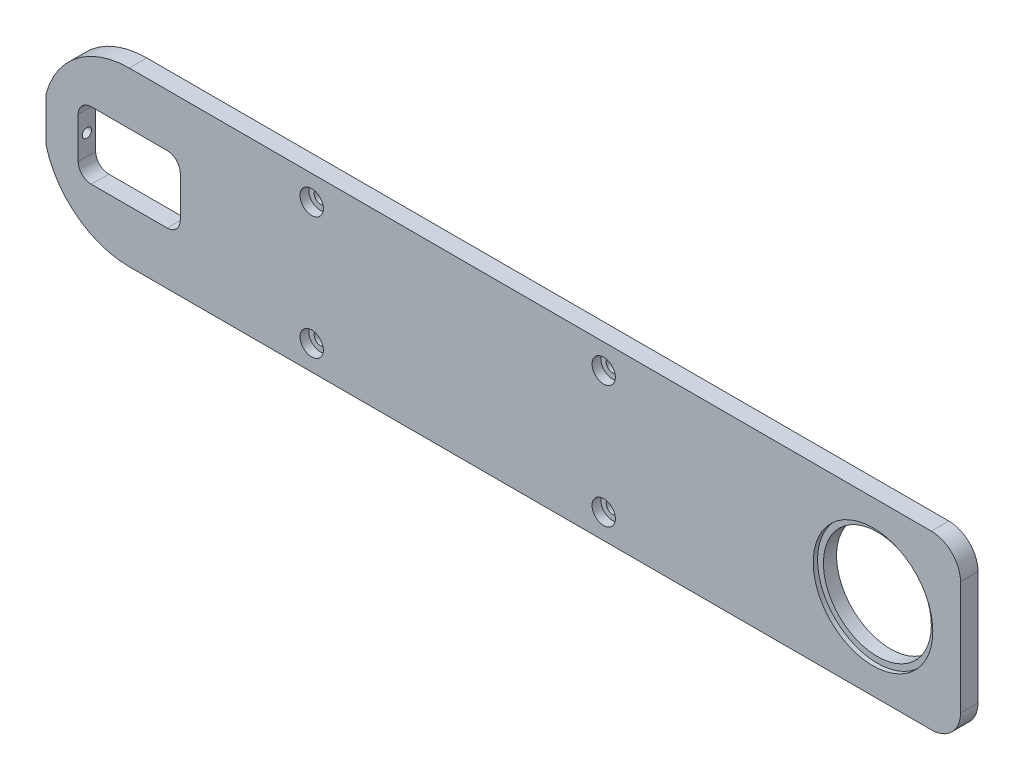
ISO-10303-21;
HEADER;
FILE_DESCRIPTION(('STEP AP214'),'2;1');
FILE_NAME('part.step','',(''),(''),'','','');
FILE_SCHEMA(('AUTOMOTIVE_DESIGN { 1 0 10303 214 1 1 1 1 }'));
ENDSEC;
DATA;
#1=APPLICATION_CONTEXT('core data for automotive mechanical design processes');
#2=APPLICATION_PROTOCOL_DEFINITION('international standard','automotive_design',2000,#1);
#3=PRODUCT_CONTEXT('',#1,'mechanical');
#4=PRODUCT('Part','Part','',(#3));
#5=PRODUCT_RELATED_PRODUCT_CATEGORY('part','',(#4));
#6=PRODUCT_DEFINITION_FORMATION('','',#4);
#7=PRODUCT_DEFINITION_CONTEXT('part definition',#1,'design');
#8=PRODUCT_DEFINITION('design','',#6,#7);
#9=PRODUCT_DEFINITION_SHAPE('','',#8);
#10=(LENGTH_UNIT() NAMED_UNIT(*) SI_UNIT(.MILLI.,.METRE.));
#11=(NAMED_UNIT(*) PLANE_ANGLE_UNIT() SI_UNIT($,.RADIAN.));
#12=(NAMED_UNIT(*) SI_UNIT($,.STERADIAN.) SOLID_ANGLE_UNIT());
#13=UNCERTAINTY_MEASURE_WITH_UNIT(LENGTH_MEASURE(1.E-05),#10,'distance_accuracy_value','');
#14=(GEOMETRIC_REPRESENTATION_CONTEXT(3) GLOBAL_UNCERTAINTY_ASSIGNED_CONTEXT((#13)) GLOBAL_UNIT_ASSIGNED_CONTEXT((#10,
#11,#12)) REPRESENTATION_CONTEXT('',''));
#15=CARTESIAN_POINT('',(0.,0.,0.));
#16=DIRECTION('',(0.,0.,1.));
#17=DIRECTION('',(1.,0.,0.));
#18=AXIS2_PLACEMENT_3D('',#15,#16,#17);
#19=CARTESIAN_POINT('',(-255.,0.,3.));
#20=DIRECTION('',(0.,0.,-1.));
#21=DIRECTION('',(-1.,0.,0.));
#22=AXIS2_PLACEMENT_3D('',#19,#20,#21);
#23=CYLINDRICAL_SURFACE('',#22,29.5);
#24=CARTESIAN_POINT('',(-255.,0.,-3.));
#25=DIRECTION('',(0.,0.,1.));
#26=DIRECTION('',(1.,0.,0.));
#27=AXIS2_PLACEMENT_3D('',#24,#25,#26);
#28=CIRCLE('',#27,29.5);
#29=CARTESIAN_POINT('',(-255.,29.5,-3.));
#30=VERTEX_POINT('',#29);
#31=CARTESIAN_POINT('',(-283.530685235374,7.5,-3.));
#32=VERTEX_POINT('',#31);
#33=EDGE_CURVE('E207',#30,#32,#28,.T.);
#34=ORIENTED_EDGE('',*,*,#33,.T.);
#35=DIRECTION('',(0.,0.,1.));
#36=VECTOR('',#35,1.);
#37=CARTESIAN_POINT('',(-283.530685235374,7.5,-3.));
#38=LINE('',#37,#36);
#39=CARTESIAN_POINT('',(-283.530685235374,7.5,3.));
#40=VERTEX_POINT('',#39);
#41=EDGE_CURVE('E191',#32,#40,#38,.T.);
#42=ORIENTED_EDGE('',*,*,#41,.T.);
#43=CARTESIAN_POINT('',(-255.,0.,3.));
#44=DIRECTION('',(0.,0.,1.));
#45=DIRECTION('',(1.,0.,0.));
#46=AXIS2_PLACEMENT_3D('',#43,#44,#45);
#47=CIRCLE('',#46,29.5);
#48=CARTESIAN_POINT('',(-255.,29.5,3.));
#49=VERTEX_POINT('',#48);
#50=EDGE_CURVE('E394',#49,#40,#47,.T.);
#51=ORIENTED_EDGE('',*,*,#50,.F.);
#52=DIRECTION('',(0.,0.,-1.));
#53=VECTOR('',#52,1.);
#54=CARTESIAN_POINT('',(-255.,29.5,3.));
#55=LINE('',#54,#53);
#56=EDGE_CURVE('E213',#49,#30,#55,.T.);
#57=ORIENTED_EDGE('',*,*,#56,.T.);
#58=EDGE_LOOP('',(#34,#42,#51,#57));
#59=FACE_BOUND('',#58,.T.);
#60=ADVANCED_FACE('F80',(#59),#23,.T.);
#61=CARTESIAN_POINT('',(-92.3223164897252,21.,3.));
#62=DIRECTION('',(0.,0.,1.));
#63=DIRECTION('',(1.,0.,0.));
#64=AXIS2_PLACEMENT_3D('',#61,#62,#63);
#65=CYLINDRICAL_SURFACE('',#64,2.15);
#66=CARTESIAN_POINT('',(-92.3223164897252,21.,-3.));
#67=DIRECTION('',(0.,0.,1.));
#68=DIRECTION('',(1.,0.,0.));
#69=AXIS2_PLACEMENT_3D('',#66,#67,#68);
#70=CIRCLE('',#69,2.15);
#71=CARTESIAN_POINT('',(-90.1723164897251,21.,-3.));
#72=VERTEX_POINT('',#71);
#73=EDGE_CURVE('E344',#72,#72,#70,.T.);
#74=ORIENTED_EDGE('',*,*,#73,.F.);
#75=EDGE_LOOP('',(#74));
#76=FACE_BOUND('',#75,.T.);
#77=CARTESIAN_POINT('',(-92.3223164897252,21.,0.));
#78=DIRECTION('',(0.,0.,1.));
#79=DIRECTION('',(1.,0.,0.));
#80=AXIS2_PLACEMENT_3D('',#77,#78,#79);
#81=CIRCLE('',#80,2.15);
#82=CARTESIAN_POINT('',(-90.1723164897251,21.,0.));
#83=VERTEX_POINT('',#82);
#84=EDGE_CURVE('E279',#83,#83,#81,.F.);
#85=ORIENTED_EDGE('',*,*,#84,.F.);
#86=EDGE_LOOP('',(#85));
#87=FACE_BOUND('',#86,.T.);
#88=ADVANCED_FACE('F409',(#76,#87),#65,.F.);
#89=CARTESIAN_POINT('',(-92.3223164897252,-21.,3.));
#90=DIRECTION('',(0.,0.,1.));
#91=DIRECTION('',(1.,0.,0.));
#92=AXIS2_PLACEMENT_3D('',#89,#90,#91);
#93=CYLINDRICAL_SURFACE('',#92,2.15);
#94=CARTESIAN_POINT('',(-92.3223164897252,-21.,-3.));
#95=DIRECTION('',(0.,0.,1.));
#96=DIRECTION('',(1.,0.,0.));
#97=AXIS2_PLACEMENT_3D('',#94,#95,#96);
#98=CIRCLE('',#97,2.15);
#99=CARTESIAN_POINT('',(-90.1723164897251,-21.,-3.));
#100=VERTEX_POINT('',#99);
#101=EDGE_CURVE('E347',#100,#100,#98,.T.);
#102=ORIENTED_EDGE('',*,*,#101,.F.);
#103=EDGE_LOOP('',(#102));
#104=FACE_BOUND('',#103,.T.);
#105=CARTESIAN_POINT('',(-92.3223164897252,-21.,0.));
#106=DIRECTION('',(0.,0.,1.));
#107=DIRECTION('',(1.,0.,0.));
#108=AXIS2_PLACEMENT_3D('',#105,#106,#107);
#109=CIRCLE('',#108,2.15);
#110=CARTESIAN_POINT('',(-90.1723164897251,-21.,0.));
#111=VERTEX_POINT('',#110);
#112=EDGE_CURVE('E274',#111,#111,#109,.F.);
#113=ORIENTED_EDGE('',*,*,#112,.F.);
#114=EDGE_LOOP('',(#113));
#115=FACE_BOUND('',#114,.T.);
#116=ADVANCED_FACE('F415',(#104,#115),#93,.F.);
#117=CARTESIAN_POINT('',(-192.444390405176,-21.,3.));
#118=DIRECTION('',(0.,0.,1.));
#119=DIRECTION('',(1.,0.,0.));
#120=AXIS2_PLACEMENT_3D('',#117,#118,#119);
#121=CYLINDRICAL_SURFACE('',#120,2.15);
#122=CARTESIAN_POINT('',(-192.444390405176,-21.,-3.));
#123=DIRECTION('',(0.,0.,1.));
#124=DIRECTION('',(1.,0.,0.));
#125=AXIS2_PLACEMENT_3D('',#122,#123,#124);
#126=CIRCLE('',#125,2.14999999999999);
#127=CARTESIAN_POINT('',(-190.294390405176,-21.,-3.));
#128=VERTEX_POINT('',#127);
#129=EDGE_CURVE('E350',#128,#128,#126,.T.);
#130=ORIENTED_EDGE('',*,*,#129,.F.);
#131=EDGE_LOOP('',(#130));
#132=FACE_BOUND('',#131,.T.);
#133=CARTESIAN_POINT('',(-192.444390405176,-21.,0.));
#134=DIRECTION('',(0.,0.,1.));
#135=DIRECTION('',(1.,0.,0.));
#136=AXIS2_PLACEMENT_3D('',#133,#134,#135);
#137=CIRCLE('',#136,2.15);
#138=CARTESIAN_POINT('',(-190.294390405176,-21.,0.));
#139=VERTEX_POINT('',#138);
#140=EDGE_CURVE('E269',#139,#139,#137,.F.);
#141=ORIENTED_EDGE('',*,*,#140,.F.);
#142=EDGE_LOOP('',(#141));
#143=FACE_BOUND('',#142,.T.);
#144=ADVANCED_FACE('F665',(#132,#143),#121,.F.);
#145=CARTESIAN_POINT('',(-192.444390405176,21.,3.));
#146=DIRECTION('',(0.,0.,1.));
#147=DIRECTION('',(1.,0.,0.));
#148=AXIS2_PLACEMENT_3D('',#145,#146,#147);
#149=CYLINDRICAL_SURFACE('',#148,2.15);
#150=CARTESIAN_POINT('',(-192.444390405176,21.,-3.));
#151=DIRECTION('',(0.,0.,1.));
#152=DIRECTION('',(1.,0.,0.));
#153=AXIS2_PLACEMENT_3D('',#150,#151,#152);
#154=CIRCLE('',#153,2.14999999999999);
#155=CARTESIAN_POINT('',(-190.294390405176,21.,-3.));
#156=VERTEX_POINT('',#155);
#157=EDGE_CURVE('E267',#156,#156,#154,.T.);
#158=ORIENTED_EDGE('',*,*,#157,.F.);
#159=EDGE_LOOP('',(#158));
#160=FACE_BOUND('',#159,.T.);
#161=CARTESIAN_POINT('',(-192.444390405176,21.,0.));
#162=DIRECTION('',(0.,0.,1.));
#163=DIRECTION('',(1.,0.,0.));
#164=AXIS2_PLACEMENT_3D('',#161,#162,#163);
#165=CIRCLE('',#164,2.15);
#166=CARTESIAN_POINT('',(-190.294390405176,21.,0.));
#167=VERTEX_POINT('',#166);
#168=EDGE_CURVE('E264',#167,#167,#165,.F.);
#169=ORIENTED_EDGE('',*,*,#168,.F.);
#170=EDGE_LOOP('',(#169));
#171=FACE_BOUND('',#170,.T.);
#172=ADVANCED_FACE('F505',(#160,#171),#149,.F.);
#173=CARTESIAN_POINT('',(0.,0.,3.));
#174=DIRECTION('',(0.,0.,-1.));
#175=DIRECTION('',(-1.,0.,0.));
#176=AXIS2_PLACEMENT_3D('',#173,#174,#175);
#177=CYLINDRICAL_SURFACE('',#176,18.5);
#178=CARTESIAN_POINT('',(0.,0.,-3.));
#179=DIRECTION('',(0.,0.,1.));
#180=DIRECTION('',(1.,0.,0.));
#181=AXIS2_PLACEMENT_3D('',#178,#179,#180);
#182=CIRCLE('',#181,18.5);
#183=CARTESIAN_POINT('',(18.5,0.,-3.));
#184=VERTEX_POINT('',#183);
#185=EDGE_CURVE('E379',#184,#184,#182,.T.);
#186=ORIENTED_EDGE('',*,*,#185,.F.);
#187=EDGE_LOOP('',(#186));
#188=FACE_BOUND('',#187,.T.);
#189=CARTESIAN_POINT('',(0.,0.,1.5));
#190=DIRECTION('',(0.,0.,1.));
#191=DIRECTION('',(1.,0.,0.));
#192=AXIS2_PLACEMENT_3D('',#189,#190,#191);
#193=CIRCLE('',#192,18.5);
#194=CARTESIAN_POINT('',(18.5,0.,1.5));
#195=VERTEX_POINT('',#194);
#196=EDGE_CURVE('E356',#195,#195,#193,.T.);
#197=ORIENTED_EDGE('',*,*,#196,.T.);
#198=EDGE_LOOP('',(#197));
#199=FACE_BOUND('',#198,.T.);
#200=ADVANCED_FACE('F502',(#188,#199),#177,.F.);
#201=CARTESIAN_POINT('',(0.,0.,3.));
#202=DIRECTION('',(0.,0.,1.));
#203=DIRECTION('',(1.,0.,0.));
#204=AXIS2_PLACEMENT_3D('',#201,#202,#203);
#205=PLANE('',#204);
#206=DIRECTION('',(0.,1.,0.));
#207=VECTOR('',#206,1.);
#208=CARTESIAN_POINT('',(-283.530685235374,7.5,3.));
#209=LINE('',#208,#207);
#210=CARTESIAN_POINT('',(-283.530685235374,-7.5,3.));
#211=VERTEX_POINT('',#210);
#212=EDGE_CURVE('E195',#211,#40,#209,.T.);
#213=ORIENTED_EDGE('',*,*,#212,.F.);
#214=CARTESIAN_POINT('',(-255.,-29.5,3.));
#215=VERTEX_POINT('',#214);
#216=EDGE_CURVE('E393',#211,#215,#47,.T.);
#217=ORIENTED_EDGE('',*,*,#216,.T.);
#218=DIRECTION('',(-1.,0.,0.));
#219=VECTOR('',#218,1.);
#220=CARTESIAN_POINT('',(0.,-29.5,3.));
#221=LINE('',#220,#219);
#222=CARTESIAN_POINT('',(20.,-29.5,3.));
#223=VERTEX_POINT('',#222);
#224=EDGE_CURVE('E225',#223,#215,#221,.T.);
#225=ORIENTED_EDGE('',*,*,#224,.F.);
#226=CARTESIAN_POINT('',(20.,-19.5,3.));
#227=DIRECTION('',(0.,0.,1.));
#228=DIRECTION('',(1.,0.,0.));
#229=AXIS2_PLACEMENT_3D('',#226,#227,#228);
#230=CIRCLE('',#229,10.);
#231=CARTESIAN_POINT('',(30.,-19.5,3.));
#232=VERTEX_POINT('',#231);
#233=EDGE_CURVE('E288',#223,#232,#230,.T.);
#234=ORIENTED_EDGE('',*,*,#233,.T.);
#235=DIRECTION('',(0.,1.,0.));
#236=VECTOR('',#235,1.);
#237=CARTESIAN_POINT('',(30.,29.5,3.));
#238=LINE('',#237,#236);
#239=CARTESIAN_POINT('',(30.,19.5,3.));
#240=VERTEX_POINT('',#239);
#241=EDGE_CURVE('E316',#232,#240,#238,.T.);
#242=ORIENTED_EDGE('',*,*,#241,.T.);
#243=CARTESIAN_POINT('',(20.,19.5,3.));
#244=DIRECTION('',(0.,0.,1.));
#245=DIRECTION('',(1.,0.,0.));
#246=AXIS2_PLACEMENT_3D('',#243,#244,#245);
#247=CIRCLE('',#246,10.);
#248=CARTESIAN_POINT('',(20.,29.5,3.));
#249=VERTEX_POINT('',#248);
#250=EDGE_CURVE('E286',#240,#249,#247,.T.);
#251=ORIENTED_EDGE('',*,*,#250,.T.);
#252=DIRECTION('',(-1.,0.,0.));
#253=VECTOR('',#252,1.);
#254=CARTESIAN_POINT('',(0.,29.5,3.));
#255=LINE('',#254,#253);
#256=EDGE_CURVE('E216',#249,#49,#255,.T.);
#257=ORIENTED_EDGE('',*,*,#256,.T.);
#258=ORIENTED_EDGE('',*,*,#50,.T.);
#259=EDGE_LOOP('',(#213,#217,#225,#234,#242,#251,#257,#258));
#260=FACE_BOUND('',#259,.T.);
#261=CARTESIAN_POINT('',(-92.3223164897252,21.,3.));
#262=DIRECTION('',(0.,0.,1.));
#263=DIRECTION('',(1.,0.,0.));
#264=AXIS2_PLACEMENT_3D('',#261,#262,#263);
#265=CIRCLE('',#264,4.00000000000001);
#266=CARTESIAN_POINT('',(-88.3223164897252,21.,3.));
#267=VERTEX_POINT('',#266);
#268=EDGE_CURVE('E321',#267,#267,#265,.T.);
#269=ORIENTED_EDGE('',*,*,#268,.F.);
#270=EDGE_LOOP('',(#269));
#271=FACE_BOUND('',#270,.T.);
#272=CARTESIAN_POINT('',(-92.3223164897252,-21.,3.));
#273=DIRECTION('',(0.,0.,1.));
#274=DIRECTION('',(1.,0.,0.));
#275=AXIS2_PLACEMENT_3D('',#272,#273,#274);
#276=CIRCLE('',#275,4.00000000000001);
#277=CARTESIAN_POINT('',(-88.3223164897252,-21.,3.));
#278=VERTEX_POINT('',#277);
#279=EDGE_CURVE('E282',#278,#278,#276,.T.);
#280=ORIENTED_EDGE('',*,*,#279,.F.);
#281=EDGE_LOOP('',(#280));
#282=FACE_BOUND('',#281,.T.);
#283=CARTESIAN_POINT('',(-192.444390405176,-21.,3.));
#284=DIRECTION('',(0.,0.,1.));
#285=DIRECTION('',(1.,0.,0.));
#286=AXIS2_PLACEMENT_3D('',#283,#284,#285);
#287=CIRCLE('',#286,3.99999999999999);
#288=CARTESIAN_POINT('',(-188.444390405176,-21.,3.));
#289=VERTEX_POINT('',#288);
#290=EDGE_CURVE('E277',#289,#289,#287,.T.);
#291=ORIENTED_EDGE('',*,*,#290,.F.);
#292=EDGE_LOOP('',(#291));
#293=FACE_BOUND('',#292,.T.);
#294=CARTESIAN_POINT('',(-192.444390405176,21.,3.));
#295=DIRECTION('',(0.,0.,1.));
#296=DIRECTION('',(1.,0.,0.));
#297=AXIS2_PLACEMENT_3D('',#294,#295,#296);
#298=CIRCLE('',#297,3.99999999999999);
#299=CARTESIAN_POINT('',(-188.444390405176,21.,3.));
#300=VERTEX_POINT('',#299);
#301=EDGE_CURVE('E268',#300,#300,#298,.T.);
#302=ORIENTED_EDGE('',*,*,#301,.F.);
#303=EDGE_LOOP('',(#302));
#304=FACE_BOUND('',#303,.T.);
#305=CARTESIAN_POINT('',(0.,0.,3.));
#306=DIRECTION('',(0.,0.,1.));
#307=DIRECTION('',(1.,0.,0.));
#308=AXIS2_PLACEMENT_3D('',#305,#306,#307);
#309=CIRCLE('',#308,20.5);
#310=CARTESIAN_POINT('',(20.5,0.,3.));
#311=VERTEX_POINT('',#310);
#312=EDGE_CURVE('E359',#311,#311,#309,.T.);
#313=ORIENTED_EDGE('',*,*,#312,.F.);
#314=EDGE_LOOP('',(#313));
#315=FACE_BOUND('',#314,.T.);
#316=DIRECTION('',(1.,0.,0.));
#317=VECTOR('',#316,1.);
#318=CARTESIAN_POINT('',(-272.5,-11.5,3.));
#319=LINE('',#318,#317);
#320=CARTESIAN_POINT('',(-268.,-11.5,3.));
#321=VERTEX_POINT('',#320);
#322=CARTESIAN_POINT('',(-242.,-11.5,3.));
#323=VERTEX_POINT('',#322);
#324=EDGE_CURVE('E376',#321,#323,#319,.T.);
#325=ORIENTED_EDGE('',*,*,#324,.F.);
#326=CARTESIAN_POINT('',(-268.,-7.00000000000005,3.));
#327=DIRECTION('',(0.,0.,1.));
#328=DIRECTION('',(1.,0.,0.));
#329=AXIS2_PLACEMENT_3D('',#326,#327,#328);
#330=CIRCLE('',#329,4.5);
#331=CARTESIAN_POINT('',(-272.5,-7.00000000000005,3.));
#332=VERTEX_POINT('',#331);
#333=EDGE_CURVE('E261',#321,#332,#330,.F.);
#334=ORIENTED_EDGE('',*,*,#333,.T.);
#335=DIRECTION('',(0.,1.,0.));
#336=VECTOR('',#335,1.);
#337=CARTESIAN_POINT('',(-272.5,-11.5,3.));
#338=LINE('',#337,#336);
#339=CARTESIAN_POINT('',(-272.5,6.99999999999995,3.));
#340=VERTEX_POINT('',#339);
#341=EDGE_CURVE('E366',#332,#340,#338,.T.);
#342=ORIENTED_EDGE('',*,*,#341,.T.);
#343=CARTESIAN_POINT('',(-268.,6.99999999999995,3.));
#344=DIRECTION('',(0.,0.,1.));
#345=DIRECTION('',(1.,0.,0.));
#346=AXIS2_PLACEMENT_3D('',#343,#344,#345);
#347=CIRCLE('',#346,4.5);
#348=CARTESIAN_POINT('',(-268.,11.5,3.));
#349=VERTEX_POINT('',#348);
#350=EDGE_CURVE('E249',#340,#349,#347,.F.);
#351=ORIENTED_EDGE('',*,*,#350,.T.);
#352=DIRECTION('',(1.,0.,0.));
#353=VECTOR('',#352,1.);
#354=CARTESIAN_POINT('',(-272.5,11.5,3.));
#355=LINE('',#354,#353);
#356=CARTESIAN_POINT('',(-242.,11.5,3.));
#357=VERTEX_POINT('',#356);
#358=EDGE_CURVE('E369',#349,#357,#355,.T.);
#359=ORIENTED_EDGE('',*,*,#358,.T.);
#360=CARTESIAN_POINT('',(-242.,6.99999999999995,3.));
#361=DIRECTION('',(0.,0.,1.));
#362=DIRECTION('',(1.,0.,0.));
#363=AXIS2_PLACEMENT_3D('',#360,#361,#362);
#364=CIRCLE('',#363,4.5);
#365=CARTESIAN_POINT('',(-237.5,6.99999999999996,3.));
#366=VERTEX_POINT('',#365);
#367=EDGE_CURVE('E253',#357,#366,#364,.F.);
#368=ORIENTED_EDGE('',*,*,#367,.T.);
#369=DIRECTION('',(0.,1.,0.));
#370=VECTOR('',#369,1.);
#371=CARTESIAN_POINT('',(-237.5,-11.5,3.));
#372=LINE('',#371,#370);
#373=CARTESIAN_POINT('',(-237.5,-7.00000000000004,3.));
#374=VERTEX_POINT('',#373);
#375=EDGE_CURVE('E373',#374,#366,#372,.T.);
#376=ORIENTED_EDGE('',*,*,#375,.F.);
#377=CARTESIAN_POINT('',(-242.,-7.00000000000005,3.));
#378=DIRECTION('',(0.,0.,1.));
#379=DIRECTION('',(1.,0.,0.));
#380=AXIS2_PLACEMENT_3D('',#377,#378,#379);
#381=CIRCLE('',#380,4.5);
#382=EDGE_CURVE('E257',#374,#323,#381,.F.);
#383=ORIENTED_EDGE('',*,*,#382,.T.);
#384=EDGE_LOOP('',(#325,#334,#342,#351,#359,#368,#376,#383));
#385=FACE_BOUND('',#384,.T.);
#386=ADVANCED_FACE('F314',(#260,#271,#282,#293,#304,#315,#385),#205,.T.);
#387=CARTESIAN_POINT('',(0.,0.,-3.));
#388=DIRECTION('',(0.,0.,1.));
#389=DIRECTION('',(1.,0.,0.));
#390=AXIS2_PLACEMENT_3D('',#387,#388,#389);
#391=PLANE('',#390);
#392=ORIENTED_EDGE('',*,*,#157,.T.);
#393=EDGE_LOOP('',(#392));
#394=FACE_BOUND('',#393,.T.);
#395=ORIENTED_EDGE('',*,*,#73,.T.);
#396=EDGE_LOOP('',(#395));
#397=FACE_BOUND('',#396,.T.);
#398=ORIENTED_EDGE('',*,*,#101,.T.);
#399=EDGE_LOOP('',(#398));
#400=FACE_BOUND('',#399,.T.);
#401=ORIENTED_EDGE('',*,*,#129,.T.);
#402=EDGE_LOOP('',(#401));
#403=FACE_BOUND('',#402,.T.);
#404=DIRECTION('',(1.,0.,0.));
#405=VECTOR('',#404,1.);
#406=CARTESIAN_POINT('',(-272.5,11.5,-3.));
#407=LINE('',#406,#405);
#408=CARTESIAN_POINT('',(-268.,11.5,-3.));
#409=VERTEX_POINT('',#408);
#410=CARTESIAN_POINT('',(-242.,11.5,-3.));
#411=VERTEX_POINT('',#410);
#412=EDGE_CURVE('E382',#409,#411,#407,.T.);
#413=ORIENTED_EDGE('',*,*,#412,.F.);
#414=CARTESIAN_POINT('',(-268.,6.99999999999995,-3.));
#415=DIRECTION('',(0.,0.,1.));
#416=DIRECTION('',(1.,0.,0.));
#417=AXIS2_PLACEMENT_3D('',#414,#415,#416);
#418=CIRCLE('',#417,4.5);
#419=CARTESIAN_POINT('',(-272.5,6.99999999999995,-3.));
#420=VERTEX_POINT('',#419);
#421=EDGE_CURVE('E247',#409,#420,#418,.T.);
#422=ORIENTED_EDGE('',*,*,#421,.T.);
#423=DIRECTION('',(0.,1.,0.));
#424=VECTOR('',#423,1.);
#425=CARTESIAN_POINT('',(-272.5,-11.5,-3.));
#426=LINE('',#425,#424);
#427=CARTESIAN_POINT('',(-272.5,-7.00000000000005,-3.));
#428=VERTEX_POINT('',#427);
#429=EDGE_CURVE('E363',#428,#420,#426,.T.);
#430=ORIENTED_EDGE('',*,*,#429,.F.);
#431=CARTESIAN_POINT('',(-268.,-7.00000000000005,-3.));
#432=DIRECTION('',(0.,0.,1.));
#433=DIRECTION('',(1.,0.,0.));
#434=AXIS2_PLACEMENT_3D('',#431,#432,#433);
#435=CIRCLE('',#434,4.5);
#436=CARTESIAN_POINT('',(-268.,-11.5,-3.));
#437=VERTEX_POINT('',#436);
#438=EDGE_CURVE('E259',#428,#437,#435,.T.);
#439=ORIENTED_EDGE('',*,*,#438,.T.);
#440=DIRECTION('',(1.,0.,0.));
#441=VECTOR('',#440,1.);
#442=CARTESIAN_POINT('',(-272.5,-11.5,-3.));
#443=LINE('',#442,#441);
#444=CARTESIAN_POINT('',(-242.,-11.5,-3.));
#445=VERTEX_POINT('',#444);
#446=EDGE_CURVE('E370',#437,#445,#443,.T.);
#447=ORIENTED_EDGE('',*,*,#446,.T.);
#448=CARTESIAN_POINT('',(-242.,-7.00000000000005,-3.));
#449=DIRECTION('',(0.,0.,1.));
#450=DIRECTION('',(1.,0.,0.));
#451=AXIS2_PLACEMENT_3D('',#448,#449,#450);
#452=CIRCLE('',#451,4.5);
#453=CARTESIAN_POINT('',(-237.5,-7.00000000000004,-3.));
#454=VERTEX_POINT('',#453);
#455=EDGE_CURVE('E255',#445,#454,#452,.T.);
#456=ORIENTED_EDGE('',*,*,#455,.T.);
#457=DIRECTION('',(0.,1.,0.));
#458=VECTOR('',#457,1.);
#459=CARTESIAN_POINT('',(-237.5,-11.5,-3.));
#460=LINE('',#459,#458);
#461=CARTESIAN_POINT('',(-237.5,6.99999999999996,-3.));
#462=VERTEX_POINT('',#461);
#463=EDGE_CURVE('E385',#454,#462,#460,.T.);
#464=ORIENTED_EDGE('',*,*,#463,.T.);
#465=CARTESIAN_POINT('',(-242.,6.99999999999995,-3.));
#466=DIRECTION('',(0.,0.,1.));
#467=DIRECTION('',(1.,0.,0.));
#468=AXIS2_PLACEMENT_3D('',#465,#466,#467);
#469=CIRCLE('',#468,4.5);
#470=EDGE_CURVE('E251',#462,#411,#469,.T.);
#471=ORIENTED_EDGE('',*,*,#470,.T.);
#472=EDGE_LOOP('',(#413,#422,#430,#439,#447,#456,#464,#471));
#473=FACE_BOUND('',#472,.T.);
#474=CARTESIAN_POINT('',(-283.530685235374,-7.5,-3.));
#475=VERTEX_POINT('',#474);
#476=CARTESIAN_POINT('',(-255.,-29.5,-3.));
#477=VERTEX_POINT('',#476);
#478=EDGE_CURVE('E209',#475,#477,#28,.T.);
#479=ORIENTED_EDGE('',*,*,#478,.F.);
#480=DIRECTION('',(0.,1.,0.));
#481=VECTOR('',#480,1.);
#482=CARTESIAN_POINT('',(-283.530685235374,7.5,-3.));
#483=LINE('',#482,#481);
#484=EDGE_CURVE('E96',#475,#32,#483,.T.);
#485=ORIENTED_EDGE('',*,*,#484,.T.);
#486=ORIENTED_EDGE('',*,*,#33,.F.);
#487=DIRECTION('',(-1.,0.,0.));
#488=VECTOR('',#487,1.);
#489=CARTESIAN_POINT('',(0.,29.5,-3.));
#490=LINE('',#489,#488);
#491=CARTESIAN_POINT('',(20.,29.5,-3.));
#492=VERTEX_POINT('',#491);
#493=EDGE_CURVE('E218',#492,#30,#490,.T.);
#494=ORIENTED_EDGE('',*,*,#493,.F.);
#495=CARTESIAN_POINT('',(20.,19.5,-3.));
#496=DIRECTION('',(0.,0.,1.));
#497=DIRECTION('',(1.,0.,0.));
#498=AXIS2_PLACEMENT_3D('',#495,#496,#497);
#499=CIRCLE('',#498,10.);
#500=CARTESIAN_POINT('',(30.,19.5,-3.));
#501=VERTEX_POINT('',#500);
#502=EDGE_CURVE('E295',#492,#501,#499,.F.);
#503=ORIENTED_EDGE('',*,*,#502,.T.);
#504=DIRECTION('',(0.,1.,0.));
#505=VECTOR('',#504,1.);
#506=CARTESIAN_POINT('',(30.,29.5,-3.));
#507=LINE('',#506,#505);
#508=CARTESIAN_POINT('',(30.,-19.5,-3.));
#509=VERTEX_POINT('',#508);
#510=EDGE_CURVE('E301',#509,#501,#507,.T.);
#511=ORIENTED_EDGE('',*,*,#510,.F.);
#512=CARTESIAN_POINT('',(20.,-19.5,-3.));
#513=DIRECTION('',(0.,0.,1.));
#514=DIRECTION('',(1.,0.,0.));
#515=AXIS2_PLACEMENT_3D('',#512,#513,#514);
#516=CIRCLE('',#515,10.);
#517=CARTESIAN_POINT('',(20.,-29.5,-3.));
#518=VERTEX_POINT('',#517);
#519=EDGE_CURVE('E89',#509,#518,#516,.F.);
#520=ORIENTED_EDGE('',*,*,#519,.T.);
#521=DIRECTION('',(-1.,0.,0.));
#522=VECTOR('',#521,1.);
#523=CARTESIAN_POINT('',(0.,-29.5,-3.));
#524=LINE('',#523,#522);
#525=EDGE_CURVE('E214',#518,#477,#524,.T.);
#526=ORIENTED_EDGE('',*,*,#525,.T.);
#527=EDGE_LOOP('',(#479,#485,#486,#494,#503,#511,#520,#526));
#528=FACE_BOUND('',#527,.T.);
#529=ORIENTED_EDGE('',*,*,#185,.T.);
#530=EDGE_LOOP('',(#529));
#531=FACE_BOUND('',#530,.T.);
#532=ADVANCED_FACE('F205',(#394,#397,#400,#403,#473,#528,#531),#391,.F.);
#533=CARTESIAN_POINT('',(0.,29.5,3.));
#534=DIRECTION('',(0.,-1.,0.));
#535=DIRECTION('',(1.,0.,0.));
#536=AXIS2_PLACEMENT_3D('',#533,#534,#535);
#537=PLANE('',#536);
#538=ORIENTED_EDGE('',*,*,#256,.F.);
#539=DIRECTION('',(0.,0.,1.));
#540=VECTOR('',#539,1.);
#541=CARTESIAN_POINT('',(20.,29.5,-3.));
#542=LINE('',#541,#540);
#543=EDGE_CURVE('E12',#249,#492,#542,.F.);
#544=ORIENTED_EDGE('',*,*,#543,.T.);
#545=ORIENTED_EDGE('',*,*,#493,.T.);
#546=ORIENTED_EDGE('',*,*,#56,.F.);
#547=EDGE_LOOP('',(#538,#544,#545,#546));
#548=FACE_BOUND('',#547,.T.);
#549=ADVANCED_FACE('F399',(#548),#537,.F.);
#550=ORIENTED_EDGE('',*,*,#216,.F.);
#551=DIRECTION('',(0.,0.,1.));
#552=VECTOR('',#551,1.);
#553=CARTESIAN_POINT('',(-283.530685235374,-7.5,-3.));
#554=LINE('',#553,#552);
#555=EDGE_CURVE('E200',#475,#211,#554,.T.);
#556=ORIENTED_EDGE('',*,*,#555,.F.);
#557=ORIENTED_EDGE('',*,*,#478,.T.);
#558=DIRECTION('',(0.,0.,-1.));
#559=VECTOR('',#558,1.);
#560=CARTESIAN_POINT('',(-255.,-29.5,3.));
#561=LINE('',#560,#559);
#562=EDGE_CURVE('E222',#215,#477,#561,.T.);
#563=ORIENTED_EDGE('',*,*,#562,.F.);
#564=EDGE_LOOP('',(#550,#556,#557,#563));
#565=FACE_BOUND('',#564,.T.);
#566=ADVANCED_FACE('F397',(#565),#23,.T.);
#567=CARTESIAN_POINT('',(0.,-29.5,3.));
#568=DIRECTION('',(0.,-1.,0.));
#569=DIRECTION('',(1.,0.,0.));
#570=AXIS2_PLACEMENT_3D('',#567,#568,#569);
#571=PLANE('',#570);
#572=ORIENTED_EDGE('',*,*,#525,.F.);
#573=DIRECTION('',(0.,0.,1.));
#574=VECTOR('',#573,1.);
#575=CARTESIAN_POINT('',(20.,-29.5,3.));
#576=LINE('',#575,#574);
#577=EDGE_CURVE('E263',#518,#223,#576,.T.);
#578=ORIENTED_EDGE('',*,*,#577,.T.);
#579=ORIENTED_EDGE('',*,*,#224,.T.);
#580=ORIENTED_EDGE('',*,*,#562,.T.);
#581=EDGE_LOOP('',(#572,#578,#579,#580));
#582=FACE_BOUND('',#581,.T.);
#583=ADVANCED_FACE('F306',(#582),#571,.T.);
#584=CARTESIAN_POINT('',(-272.5,-11.5,3.));
#585=DIRECTION('',(-1.,0.,0.));
#586=DIRECTION('',(0.,0.,1.));
#587=AXIS2_PLACEMENT_3D('',#584,#585,#586);
#588=PLANE('',#587);
#589=CARTESIAN_POINT('',(-272.5,0.,0.));
#590=DIRECTION('',(-1.,0.,0.));
#591=DIRECTION('',(0.,0.,1.));
#592=AXIS2_PLACEMENT_3D('',#589,#590,#591);
#593=CIRCLE('',#592,1.6);
#594=CARTESIAN_POINT('',(-272.5,0.,1.6));
#595=VERTEX_POINT('',#594);
#596=EDGE_CURVE('E353',#595,#595,#593,.T.);
#597=ORIENTED_EDGE('',*,*,#596,.T.);
#598=EDGE_LOOP('',(#597));
#599=FACE_BOUND('',#598,.T.);
#600=ORIENTED_EDGE('',*,*,#429,.T.);
#601=DIRECTION('',(0.,0.,-1.));
#602=VECTOR('',#601,1.);
#603=CARTESIAN_POINT('',(-272.5,6.99999999999995,3.));
#604=LINE('',#603,#602);
#605=EDGE_CURVE('E235',#420,#340,#604,.F.);
#606=ORIENTED_EDGE('',*,*,#605,.T.);
#607=ORIENTED_EDGE('',*,*,#341,.F.);
#608=DIRECTION('',(0.,0.,-1.));
#609=VECTOR('',#608,1.);
#610=CARTESIAN_POINT('',(-272.5,-7.00000000000005,3.));
#611=LINE('',#610,#609);
#612=EDGE_CURVE('E232',#332,#428,#611,.T.);
#613=ORIENTED_EDGE('',*,*,#612,.T.);
#614=EDGE_LOOP('',(#600,#606,#607,#613));
#615=FACE_BOUND('',#614,.T.);
#616=ADVANCED_FACE('F426',(#599,#615),#588,.F.);
#617=CARTESIAN_POINT('',(-272.5,-11.5,3.));
#618=DIRECTION('',(0.,1.,0.));
#619=DIRECTION('',(0.,0.,1.));
#620=AXIS2_PLACEMENT_3D('',#617,#618,#619);
#621=PLANE('',#620);
#622=ORIENTED_EDGE('',*,*,#324,.T.);
#623=DIRECTION('',(0.,0.,-1.));
#624=VECTOR('',#623,1.);
#625=CARTESIAN_POINT('',(-242.,-11.5,-3.));
#626=LINE('',#625,#624);
#627=EDGE_CURVE('E244',#323,#445,#626,.T.);
#628=ORIENTED_EDGE('',*,*,#627,.T.);
#629=ORIENTED_EDGE('',*,*,#446,.F.);
#630=DIRECTION('',(0.,0.,-1.));
#631=VECTOR('',#630,1.);
#632=CARTESIAN_POINT('',(-268.,-11.5,3.));
#633=LINE('',#632,#631);
#634=EDGE_CURVE('E242',#437,#321,#633,.F.);
#635=ORIENTED_EDGE('',*,*,#634,.T.);
#636=EDGE_LOOP('',(#622,#628,#629,#635));
#637=FACE_BOUND('',#636,.T.);
#638=ADVANCED_FACE('F484',(#637),#621,.T.);
#639=CARTESIAN_POINT('',(-237.5,-11.5,3.));
#640=DIRECTION('',(-1.,0.,0.));
#641=DIRECTION('',(0.,-1.,0.));
#642=AXIS2_PLACEMENT_3D('',#639,#640,#641);
#643=PLANE('',#642);
#644=ORIENTED_EDGE('',*,*,#375,.T.);
#645=DIRECTION('',(0.,0.,-1.));
#646=VECTOR('',#645,1.);
#647=CARTESIAN_POINT('',(-237.5,6.99999999999996,3.));
#648=LINE('',#647,#646);
#649=EDGE_CURVE('E239',#366,#462,#648,.T.);
#650=ORIENTED_EDGE('',*,*,#649,.T.);
#651=ORIENTED_EDGE('',*,*,#463,.F.);
#652=DIRECTION('',(0.,0.,-1.));
#653=VECTOR('',#652,1.);
#654=CARTESIAN_POINT('',(-237.5,-7.00000000000004,3.));
#655=LINE('',#654,#653);
#656=EDGE_CURVE('E237',#454,#374,#655,.F.);
#657=ORIENTED_EDGE('',*,*,#656,.T.);
#658=EDGE_LOOP('',(#644,#650,#651,#657));
#659=FACE_BOUND('',#658,.T.);
#660=ADVANCED_FACE('F479',(#659),#643,.T.);
#661=CARTESIAN_POINT('',(-272.5,11.5,3.));
#662=DIRECTION('',(0.,1.,0.));
#663=DIRECTION('',(0.,0.,1.));
#664=AXIS2_PLACEMENT_3D('',#661,#662,#663);
#665=PLANE('',#664);
#666=ORIENTED_EDGE('',*,*,#358,.F.);
#667=DIRECTION('',(0.,0.,-1.));
#668=VECTOR('',#667,1.);
#669=CARTESIAN_POINT('',(-268.,11.5,-3.));
#670=LINE('',#669,#668);
#671=EDGE_CURVE('E229',#349,#409,#670,.T.);
#672=ORIENTED_EDGE('',*,*,#671,.T.);
#673=ORIENTED_EDGE('',*,*,#412,.T.);
#674=DIRECTION('',(0.,0.,-1.));
#675=VECTOR('',#674,1.);
#676=CARTESIAN_POINT('',(-242.,11.5,3.));
#677=LINE('',#676,#675);
#678=EDGE_CURVE('E227',#411,#357,#677,.F.);
#679=ORIENTED_EDGE('',*,*,#678,.T.);
#680=EDGE_LOOP('',(#666,#672,#673,#679));
#681=FACE_BOUND('',#680,.T.);
#682=ADVANCED_FACE('F472',(#681),#665,.F.);
#683=CARTESIAN_POINT('',(0.,0.,1.5));
#684=DIRECTION('',(0.,0.,1.));
#685=DIRECTION('',(1.,0.,0.));
#686=AXIS2_PLACEMENT_3D('',#683,#684,#685);
#687=CYLINDRICAL_SURFACE('',#686,20.5);
#688=CARTESIAN_POINT('',(0.,0.,1.5));
#689=DIRECTION('',(0.,0.,1.));
#690=DIRECTION('',(1.,0.,0.));
#691=AXIS2_PLACEMENT_3D('',#688,#689,#690);
#692=CIRCLE('',#691,20.5);
#693=CARTESIAN_POINT('',(20.5,0.,1.5));
#694=VERTEX_POINT('',#693);
#695=EDGE_CURVE('E360',#694,#694,#692,.T.);
#696=ORIENTED_EDGE('',*,*,#695,.F.);
#697=EDGE_LOOP('',(#696));
#698=FACE_BOUND('',#697,.T.);
#699=ORIENTED_EDGE('',*,*,#312,.T.);
#700=EDGE_LOOP('',(#699));
#701=FACE_BOUND('',#700,.T.);
#702=ADVANCED_FACE('F497',(#698,#701),#687,.F.);
#703=CARTESIAN_POINT('',(0.,0.,1.5));
#704=DIRECTION('',(0.,0.,1.));
#705=DIRECTION('',(1.,0.,0.));
#706=AXIS2_PLACEMENT_3D('',#703,#704,#705);
#707=PLANE('',#706);
#708=ORIENTED_EDGE('',*,*,#196,.F.);
#709=EDGE_LOOP('',(#708));
#710=FACE_BOUND('',#709,.T.);
#711=ORIENTED_EDGE('',*,*,#695,.T.);
#712=EDGE_LOOP('',(#711));
#713=FACE_BOUND('',#712,.T.);
#714=ADVANCED_FACE('F438',(#710,#713),#707,.T.);
#715=CARTESIAN_POINT('',(-268.,6.99999999999995,3.));
#716=DIRECTION('',(0.,0.,1.));
#717=DIRECTION('',(1.,0.,0.));
#718=AXIS2_PLACEMENT_3D('',#715,#716,#717);
#719=CYLINDRICAL_SURFACE('',#718,4.5);
#720=ORIENTED_EDGE('',*,*,#350,.F.);
#721=ORIENTED_EDGE('',*,*,#605,.F.);
#722=ORIENTED_EDGE('',*,*,#421,.F.);
#723=ORIENTED_EDGE('',*,*,#671,.F.);
#724=EDGE_LOOP('',(#720,#721,#722,#723));
#725=FACE_BOUND('',#724,.T.);
#726=ADVANCED_FACE('F434',(#725),#719,.F.);
#727=CARTESIAN_POINT('',(-242.,6.99999999999995,3.));
#728=DIRECTION('',(0.,0.,-1.));
#729=DIRECTION('',(-1.,0.,0.));
#730=AXIS2_PLACEMENT_3D('',#727,#728,#729);
#731=CYLINDRICAL_SURFACE('',#730,4.5);
#732=ORIENTED_EDGE('',*,*,#367,.F.);
#733=ORIENTED_EDGE('',*,*,#678,.F.);
#734=ORIENTED_EDGE('',*,*,#470,.F.);
#735=ORIENTED_EDGE('',*,*,#649,.F.);
#736=EDGE_LOOP('',(#732,#733,#734,#735));
#737=FACE_BOUND('',#736,.T.);
#738=ADVANCED_FACE('F437',(#737),#731,.F.);
#739=CARTESIAN_POINT('',(-242.,-7.00000000000005,3.));
#740=DIRECTION('',(0.,0.,1.));
#741=DIRECTION('',(1.,0.,0.));
#742=AXIS2_PLACEMENT_3D('',#739,#740,#741);
#743=CYLINDRICAL_SURFACE('',#742,4.5);
#744=ORIENTED_EDGE('',*,*,#382,.F.);
#745=ORIENTED_EDGE('',*,*,#656,.F.);
#746=ORIENTED_EDGE('',*,*,#455,.F.);
#747=ORIENTED_EDGE('',*,*,#627,.F.);
#748=EDGE_LOOP('',(#744,#745,#746,#747));
#749=FACE_BOUND('',#748,.T.);
#750=ADVANCED_FACE('F442',(#749),#743,.F.);
#751=CARTESIAN_POINT('',(-268.,-7.00000000000005,3.));
#752=DIRECTION('',(0.,0.,-1.));
#753=DIRECTION('',(-1.,0.,0.));
#754=AXIS2_PLACEMENT_3D('',#751,#752,#753);
#755=CYLINDRICAL_SURFACE('',#754,4.5);
#756=ORIENTED_EDGE('',*,*,#333,.F.);
#757=ORIENTED_EDGE('',*,*,#634,.F.);
#758=ORIENTED_EDGE('',*,*,#438,.F.);
#759=ORIENTED_EDGE('',*,*,#612,.F.);
#760=EDGE_LOOP('',(#756,#757,#758,#759));
#761=FACE_BOUND('',#760,.T.);
#762=ADVANCED_FACE('F446',(#761),#755,.F.);
#763=CARTESIAN_POINT('',(-284.5,0.,0.));
#764=DIRECTION('',(-1.,0.,0.));
#765=DIRECTION('',(0.,0.,1.));
#766=AXIS2_PLACEMENT_3D('',#763,#764,#765);
#767=CYLINDRICAL_SURFACE('',#766,1.6);
#768=CARTESIAN_POINT('',(-283.530685235374,0.,0.));
#769=DIRECTION('',(1.,0.,0.));
#770=DIRECTION('',(0.,0.,-1.));
#771=AXIS2_PLACEMENT_3D('',#768,#769,#770);
#772=CIRCLE('',#771,1.6);
#773=CARTESIAN_POINT('',(-283.530685235374,0.,-1.6));
#774=VERTEX_POINT('',#773);
#775=EDGE_CURVE('E84',#774,#774,#772,.F.);
#776=ORIENTED_EDGE('',*,*,#775,.T.);
#777=EDGE_LOOP('',(#776));
#778=FACE_BOUND('',#777,.T.);
#779=ORIENTED_EDGE('',*,*,#596,.F.);
#780=EDGE_LOOP('',(#779));
#781=FACE_BOUND('',#780,.T.);
#782=ADVANCED_FACE('F449',(#778,#781),#767,.F.);
#783=CARTESIAN_POINT('',(-192.444390405176,21.,0.));
#784=DIRECTION('',(0.,0.,1.));
#785=DIRECTION('',(1.,0.,0.));
#786=AXIS2_PLACEMENT_3D('',#783,#784,#785);
#787=PLANE('',#786);
#788=CARTESIAN_POINT('',(-192.444390405176,21.,0.));
#789=DIRECTION('',(0.,0.,1.));
#790=DIRECTION('',(1.,0.,0.));
#791=AXIS2_PLACEMENT_3D('',#788,#789,#790);
#792=CIRCLE('',#791,3.99999999999999);
#793=CARTESIAN_POINT('',(-188.444390405176,21.,0.));
#794=VERTEX_POINT('',#793);
#795=EDGE_CURVE('E272',#794,#794,#792,.T.);
#796=ORIENTED_EDGE('',*,*,#795,.T.);
#797=EDGE_LOOP('',(#796));
#798=FACE_BOUND('',#797,.T.);
#799=ORIENTED_EDGE('',*,*,#168,.T.);
#800=EDGE_LOOP('',(#799));
#801=FACE_BOUND('',#800,.T.);
#802=ADVANCED_FACE('F455',(#798,#801),#787,.T.);
#803=CARTESIAN_POINT('',(-192.444390405176,21.,3.));
#804=DIRECTION('',(0.,0.,-1.));
#805=DIRECTION('',(-1.,0.,0.));
#806=AXIS2_PLACEMENT_3D('',#803,#804,#805);
#807=CYLINDRICAL_SURFACE('',#806,3.99999999999999);
#808=ORIENTED_EDGE('',*,*,#301,.T.);
#809=EDGE_LOOP('',(#808));
#810=FACE_BOUND('',#809,.T.);
#811=ORIENTED_EDGE('',*,*,#795,.F.);
#812=EDGE_LOOP('',(#811));
#813=FACE_BOUND('',#812,.T.);
#814=ADVANCED_FACE('F581',(#810,#813),#807,.F.);
#815=CARTESIAN_POINT('',(-192.444390405176,-21.,0.));
#816=DIRECTION('',(0.,0.,1.));
#817=DIRECTION('',(1.,0.,0.));
#818=AXIS2_PLACEMENT_3D('',#815,#816,#817);
#819=PLANE('',#818);
#820=CARTESIAN_POINT('',(-192.444390405176,-21.,0.));
#821=DIRECTION('',(0.,0.,1.));
#822=DIRECTION('',(1.,0.,0.));
#823=AXIS2_PLACEMENT_3D('',#820,#821,#822);
#824=CIRCLE('',#823,3.99999999999999);
#825=CARTESIAN_POINT('',(-188.444390405176,-21.,0.));
#826=VERTEX_POINT('',#825);
#827=EDGE_CURVE('E273',#826,#826,#824,.T.);
#828=ORIENTED_EDGE('',*,*,#827,.T.);
#829=EDGE_LOOP('',(#828));
#830=FACE_BOUND('',#829,.T.);
#831=ORIENTED_EDGE('',*,*,#140,.T.);
#832=EDGE_LOOP('',(#831));
#833=FACE_BOUND('',#832,.T.);
#834=ADVANCED_FACE('F590',(#830,#833),#819,.T.);
#835=CARTESIAN_POINT('',(-192.444390405176,-21.,3.));
#836=DIRECTION('',(0.,0.,-1.));
#837=DIRECTION('',(-1.,0.,0.));
#838=AXIS2_PLACEMENT_3D('',#835,#836,#837);
#839=CYLINDRICAL_SURFACE('',#838,3.99999999999999);
#840=ORIENTED_EDGE('',*,*,#290,.T.);
#841=EDGE_LOOP('',(#840));
#842=FACE_BOUND('',#841,.T.);
#843=ORIENTED_EDGE('',*,*,#827,.F.);
#844=EDGE_LOOP('',(#843));
#845=FACE_BOUND('',#844,.T.);
#846=ADVANCED_FACE('F598',(#842,#845),#839,.F.);
#847=CARTESIAN_POINT('',(-92.3223164897252,-21.,0.));
#848=DIRECTION('',(0.,0.,1.));
#849=DIRECTION('',(1.,0.,0.));
#850=AXIS2_PLACEMENT_3D('',#847,#848,#849);
#851=PLANE('',#850);
#852=CARTESIAN_POINT('',(-92.3223164897252,-21.,0.));
#853=DIRECTION('',(0.,0.,1.));
#854=DIRECTION('',(1.,0.,0.));
#855=AXIS2_PLACEMENT_3D('',#852,#853,#854);
#856=CIRCLE('',#855,4.00000000000001);
#857=CARTESIAN_POINT('',(-88.3223164897252,-21.,0.));
#858=VERTEX_POINT('',#857);
#859=EDGE_CURVE('E278',#858,#858,#856,.T.);
#860=ORIENTED_EDGE('',*,*,#859,.T.);
#861=EDGE_LOOP('',(#860));
#862=FACE_BOUND('',#861,.T.);
#863=ORIENTED_EDGE('',*,*,#112,.T.);
#864=EDGE_LOOP('',(#863));
#865=FACE_BOUND('',#864,.T.);
#866=ADVANCED_FACE('F606',(#862,#865),#851,.T.);
#867=CARTESIAN_POINT('',(-92.3223164897252,-21.,3.));
#868=DIRECTION('',(0.,0.,-1.));
#869=DIRECTION('',(-1.,0.,0.));
#870=AXIS2_PLACEMENT_3D('',#867,#868,#869);
#871=CYLINDRICAL_SURFACE('',#870,4.00000000000001);
#872=ORIENTED_EDGE('',*,*,#279,.T.);
#873=EDGE_LOOP('',(#872));
#874=FACE_BOUND('',#873,.T.);
#875=ORIENTED_EDGE('',*,*,#859,.F.);
#876=EDGE_LOOP('',(#875));
#877=FACE_BOUND('',#876,.T.);
#878=ADVANCED_FACE('F614',(#874,#877),#871,.F.);
#879=CARTESIAN_POINT('',(-92.3223164897252,21.,0.));
#880=DIRECTION('',(0.,0.,1.));
#881=DIRECTION('',(1.,0.,0.));
#882=AXIS2_PLACEMENT_3D('',#879,#880,#881);
#883=PLANE('',#882);
#884=CARTESIAN_POINT('',(-92.3223164897252,21.,0.));
#885=DIRECTION('',(0.,0.,1.));
#886=DIRECTION('',(1.,0.,0.));
#887=AXIS2_PLACEMENT_3D('',#884,#885,#886);
#888=CIRCLE('',#887,4.00000000000001);
#889=CARTESIAN_POINT('',(-88.3223164897252,21.,0.));
#890=VERTEX_POINT('',#889);
#891=EDGE_CURVE('E283',#890,#890,#888,.T.);
#892=ORIENTED_EDGE('',*,*,#891,.T.);
#893=EDGE_LOOP('',(#892));
#894=FACE_BOUND('',#893,.T.);
#895=ORIENTED_EDGE('',*,*,#84,.T.);
#896=EDGE_LOOP('',(#895));
#897=FACE_BOUND('',#896,.T.);
#898=ADVANCED_FACE('F622',(#894,#897),#883,.T.);
#899=CARTESIAN_POINT('',(-92.3223164897252,21.,3.));
#900=DIRECTION('',(0.,0.,-1.));
#901=DIRECTION('',(-1.,0.,0.));
#902=AXIS2_PLACEMENT_3D('',#899,#900,#901);
#903=CYLINDRICAL_SURFACE('',#902,4.00000000000001);
#904=ORIENTED_EDGE('',*,*,#268,.T.);
#905=EDGE_LOOP('',(#904));
#906=FACE_BOUND('',#905,.T.);
#907=ORIENTED_EDGE('',*,*,#891,.F.);
#908=EDGE_LOOP('',(#907));
#909=FACE_BOUND('',#908,.T.);
#910=ADVANCED_FACE('F550',(#906,#909),#903,.F.);
#911=CARTESIAN_POINT('',(30.,29.5,-3.));
#912=DIRECTION('',(1.,0.,0.));
#913=DIRECTION('',(0.,1.,0.));
#914=AXIS2_PLACEMENT_3D('',#911,#912,#913);
#915=PLANE('',#914);
#916=ORIENTED_EDGE('',*,*,#241,.F.);
#917=DIRECTION('',(0.,0.,1.));
#918=VECTOR('',#917,1.);
#919=CARTESIAN_POINT('',(30.,-19.5,-3.));
#920=LINE('',#919,#918);
#921=EDGE_CURVE('E293',#232,#509,#920,.F.);
#922=ORIENTED_EDGE('',*,*,#921,.T.);
#923=ORIENTED_EDGE('',*,*,#510,.T.);
#924=DIRECTION('',(0.,0.,1.));
#925=VECTOR('',#924,1.);
#926=CARTESIAN_POINT('',(30.,19.5,3.));
#927=LINE('',#926,#925);
#928=EDGE_CURVE('E290',#501,#240,#927,.T.);
#929=ORIENTED_EDGE('',*,*,#928,.T.);
#930=EDGE_LOOP('',(#916,#922,#923,#929));
#931=FACE_BOUND('',#930,.T.);
#932=ADVANCED_FACE('F318',(#931),#915,.T.);
#933=CARTESIAN_POINT('',(20.,-19.5,3.));
#934=DIRECTION('',(0.,0.,1.));
#935=DIRECTION('',(1.,0.,0.));
#936=AXIS2_PLACEMENT_3D('',#933,#934,#935);
#937=CYLINDRICAL_SURFACE('',#936,10.);
#938=ORIENTED_EDGE('',*,*,#519,.F.);
#939=ORIENTED_EDGE('',*,*,#921,.F.);
#940=ORIENTED_EDGE('',*,*,#233,.F.);
#941=ORIENTED_EDGE('',*,*,#577,.F.);
#942=EDGE_LOOP('',(#938,#939,#940,#941));
#943=FACE_BOUND('',#942,.T.);
#944=ADVANCED_FACE('F310',(#943),#937,.T.);
#945=CARTESIAN_POINT('',(20.,19.5,-3.));
#946=DIRECTION('',(0.,0.,-1.));
#947=DIRECTION('',(-1.,0.,0.));
#948=AXIS2_PLACEMENT_3D('',#945,#946,#947);
#949=CYLINDRICAL_SURFACE('',#948,10.);
#950=ORIENTED_EDGE('',*,*,#502,.F.);
#951=ORIENTED_EDGE('',*,*,#543,.F.);
#952=ORIENTED_EDGE('',*,*,#250,.F.);
#953=ORIENTED_EDGE('',*,*,#928,.F.);
#954=EDGE_LOOP('',(#950,#951,#952,#953));
#955=FACE_BOUND('',#954,.T.);
#956=ADVANCED_FACE('F82',(#955),#949,.T.);
#957=CARTESIAN_POINT('',(-283.530685235374,7.5,-3.));
#958=DIRECTION('',(1.,0.,0.));
#959=DIRECTION('',(0.,0.,-1.));
#960=AXIS2_PLACEMENT_3D('',#957,#958,#959);
#961=PLANE('',#960);
#962=ORIENTED_EDGE('',*,*,#212,.T.);
#963=ORIENTED_EDGE('',*,*,#41,.F.);
#964=ORIENTED_EDGE('',*,*,#484,.F.);
#965=ORIENTED_EDGE('',*,*,#555,.T.);
#966=EDGE_LOOP('',(#962,#963,#964,#965));
#967=FACE_BOUND('',#966,.T.);
#968=ORIENTED_EDGE('',*,*,#775,.F.);
#969=EDGE_LOOP('',(#968));
#970=FACE_BOUND('',#969,.T.);
#971=ADVANCED_FACE('F192',(#967,#970),#961,.F.);
#972=CLOSED_SHELL('',(#60,#88,#116,#144,#172,#200,#386,#532,#549,#566,#583,#616,#638,#660,#682,
#702,#714,#726,#738,#750,#762,#782,#802,#814,#834,#846,#866,#878,#898,#910,#932,#944,#956,#971));
#973=MANIFOLD_SOLID_BREP('B2',#972);
#974=ADVANCED_BREP_SHAPE_REPRESENTATION('',(#18,#973),#14);
#975=SHAPE_DEFINITION_REPRESENTATION(#9,#974);
ENDSEC;
END-ISO-10303-21;
